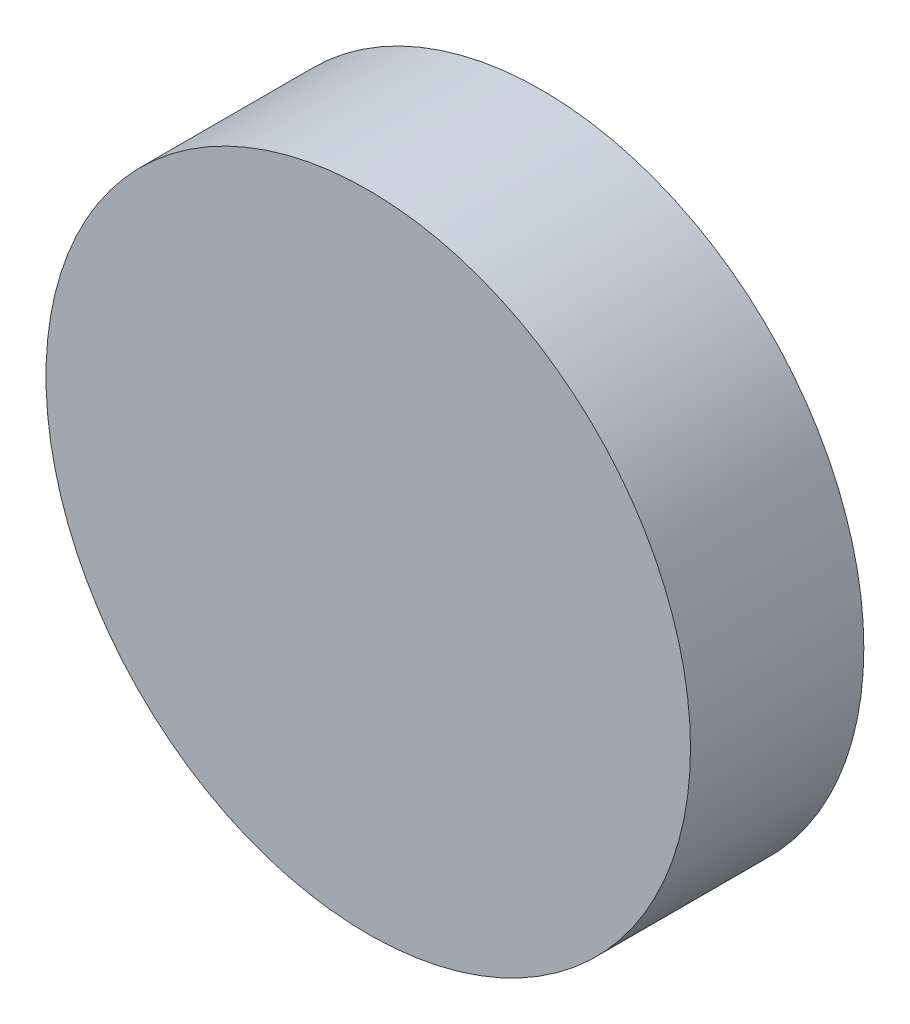
ISO-10303-21;
HEADER;
FILE_DESCRIPTION(('STEP AP214'),'2;1');
FILE_NAME('part.step','',(''),(''),'','','');
FILE_SCHEMA(('AUTOMOTIVE_DESIGN { 1 0 10303 214 1 1 1 1 }'));
ENDSEC;
DATA;
#1=APPLICATION_CONTEXT('core data for automotive mechanical design processes');
#2=APPLICATION_PROTOCOL_DEFINITION('international standard','automotive_design',2000,#1);
#3=PRODUCT_CONTEXT('',#1,'mechanical');
#4=PRODUCT('Part','Part','',(#3));
#5=PRODUCT_RELATED_PRODUCT_CATEGORY('part','',(#4));
#6=PRODUCT_DEFINITION_FORMATION('','',#4);
#7=PRODUCT_DEFINITION_CONTEXT('part definition',#1,'design');
#8=PRODUCT_DEFINITION('design','',#6,#7);
#9=PRODUCT_DEFINITION_SHAPE('','',#8);
#10=(LENGTH_UNIT() NAMED_UNIT(*) SI_UNIT(.MILLI.,.METRE.));
#11=(NAMED_UNIT(*) PLANE_ANGLE_UNIT() SI_UNIT($,.RADIAN.));
#12=(NAMED_UNIT(*) SI_UNIT($,.STERADIAN.) SOLID_ANGLE_UNIT());
#13=UNCERTAINTY_MEASURE_WITH_UNIT(LENGTH_MEASURE(1.E-05),#10,'distance_accuracy_value','');
#14=(GEOMETRIC_REPRESENTATION_CONTEXT(3) GLOBAL_UNCERTAINTY_ASSIGNED_CONTEXT((#13)) GLOBAL_UNIT_ASSIGNED_CONTEXT((#10,
#11,#12)) REPRESENTATION_CONTEXT('',''));
#15=CARTESIAN_POINT('',(0.,0.,0.));
#16=DIRECTION('',(0.,0.,1.));
#17=DIRECTION('',(1.,0.,0.));
#18=AXIS2_PLACEMENT_3D('',#15,#16,#17);
#19=CARTESIAN_POINT('',(-2.80597137458571,0.,10.));
#20=DIRECTION('',(0.,0.,-1.));
#21=DIRECTION('',(-1.,0.,0.));
#22=AXIS2_PLACEMENT_3D('',#19,#20,#21);
#23=CYLINDRICAL_SURFACE('',#22,18.5915936232702);
#24=CARTESIAN_POINT('',(-2.80597137458571,0.,10.));
#25=DIRECTION('',(0.,0.,1.));
#26=DIRECTION('',(1.,0.,0.));
#27=AXIS2_PLACEMENT_3D('',#24,#25,#26);
#28=CIRCLE('',#27,18.5915936232702);
#29=CARTESIAN_POINT('',(15.7856222486845,0.,10.));
#30=VERTEX_POINT('',#29);
#31=EDGE_CURVE('E10',#30,#30,#28,.T.);
#32=ORIENTED_EDGE('',*,*,#31,.F.);
#33=EDGE_LOOP('',(#32));
#34=FACE_BOUND('',#33,.T.);
#35=CARTESIAN_POINT('',(-2.80597137458571,0.,0.));
#36=DIRECTION('',(0.,0.,1.));
#37=DIRECTION('',(1.,0.,0.));
#38=AXIS2_PLACEMENT_3D('',#35,#36,#37);
#39=CIRCLE('',#38,18.5915936232702);
#40=CARTESIAN_POINT('',(15.7856222486845,0.,0.));
#41=VERTEX_POINT('',#40);
#42=EDGE_CURVE('E34',#41,#41,#39,.T.);
#43=ORIENTED_EDGE('',*,*,#42,.T.);
#44=EDGE_LOOP('',(#43));
#45=FACE_BOUND('',#44,.T.);
#46=ADVANCED_FACE('F31',(#34,#45),#23,.T.);
#47=CARTESIAN_POINT('',(-2.80597137458571,0.,10.));
#48=DIRECTION('',(0.,0.,1.));
#49=DIRECTION('',(1.,0.,0.));
#50=AXIS2_PLACEMENT_3D('',#47,#48,#49);
#51=PLANE('',#50);
#52=ORIENTED_EDGE('',*,*,#31,.T.);
#53=EDGE_LOOP('',(#52));
#54=FACE_BOUND('',#53,.T.);
#55=ADVANCED_FACE('F46',(#54),#51,.T.);
#56=CARTESIAN_POINT('',(-2.80597137458571,0.,0.));
#57=DIRECTION('',(0.,0.,1.));
#58=DIRECTION('',(1.,0.,0.));
#59=AXIS2_PLACEMENT_3D('',#56,#57,#58);
#60=PLANE('',#59);
#61=ORIENTED_EDGE('',*,*,#42,.F.);
#62=EDGE_LOOP('',(#61));
#63=FACE_BOUND('',#62,.T.);
#64=ADVANCED_FACE('F44',(#63),#60,.F.);
#65=CLOSED_SHELL('',(#46,#55,#64));
#66=MANIFOLD_SOLID_BREP('B2',#65);
#67=ADVANCED_BREP_SHAPE_REPRESENTATION('',(#18,#66),#14);
#68=SHAPE_DEFINITION_REPRESENTATION(#9,#67);
ENDSEC;
END-ISO-10303-21;
